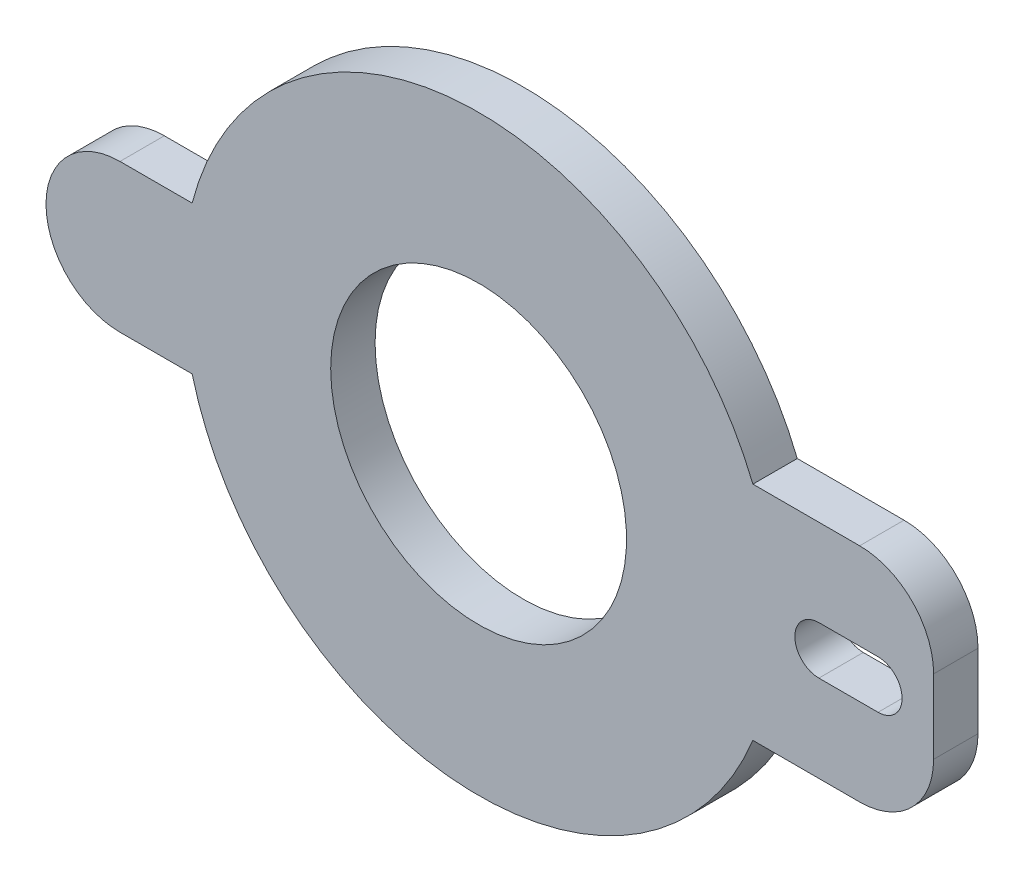
ISO-10303-21;
HEADER;
FILE_DESCRIPTION(('STEP AP214'),'2;1');
FILE_NAME('part.step','',(''),(''),'','','');
FILE_SCHEMA(('AUTOMOTIVE_DESIGN { 1 0 10303 214 1 1 1 1 }'));
ENDSEC;
DATA;
#1=APPLICATION_CONTEXT('core data for automotive mechanical design processes');
#2=APPLICATION_PROTOCOL_DEFINITION('international standard','automotive_design',2000,#1);
#3=PRODUCT_CONTEXT('',#1,'mechanical');
#4=PRODUCT('Part','Part','',(#3));
#5=PRODUCT_RELATED_PRODUCT_CATEGORY('part','',(#4));
#6=PRODUCT_DEFINITION_FORMATION('','',#4);
#7=PRODUCT_DEFINITION_CONTEXT('part definition',#1,'design');
#8=PRODUCT_DEFINITION('design','',#6,#7);
#9=PRODUCT_DEFINITION_SHAPE('','',#8);
#10=(LENGTH_UNIT() NAMED_UNIT(*) SI_UNIT(.MILLI.,.METRE.));
#11=(NAMED_UNIT(*) PLANE_ANGLE_UNIT() SI_UNIT($,.RADIAN.));
#12=(NAMED_UNIT(*) SI_UNIT($,.STERADIAN.) SOLID_ANGLE_UNIT());
#13=UNCERTAINTY_MEASURE_WITH_UNIT(LENGTH_MEASURE(1.E-05),#10,'distance_accuracy_value','');
#14=(GEOMETRIC_REPRESENTATION_CONTEXT(3) GLOBAL_UNCERTAINTY_ASSIGNED_CONTEXT((#13)) GLOBAL_UNIT_ASSIGNED_CONTEXT((#10,
#11,#12)) REPRESENTATION_CONTEXT('',''));
#15=CARTESIAN_POINT('',(0.,0.,0.));
#16=DIRECTION('',(0.,0.,1.));
#17=DIRECTION('',(1.,0.,0.));
#18=AXIS2_PLACEMENT_3D('',#15,#16,#17);
#19=CARTESIAN_POINT('',(-53.0320113912317,7.70338264670499,0.));
#20=DIRECTION('',(0.,0.,1.));
#21=DIRECTION('',(1.,0.,0.));
#22=AXIS2_PLACEMENT_3D('',#19,#20,#21);
#23=CYLINDRICAL_SURFACE('',#22,40.);
#24=CARTESIAN_POINT('',(-53.0320113912317,7.70338264670499,6.));
#25=DIRECTION('',(0.,0.,1.));
#26=DIRECTION('',(1.,0.,0.));
#27=AXIS2_PLACEMENT_3D('',#24,#25,#26);
#28=CIRCLE('',#27,40.);
#29=CARTESIAN_POINT('',(-15.9510189557534,22.703382646705,6.));
#30=VERTEX_POINT('',#29);
#31=CARTESIAN_POINT('',(-91.7618448533059,17.703382646705,6.));
#32=VERTEX_POINT('',#31);
#33=EDGE_CURVE('E173',#30,#32,#28,.T.);
#34=ORIENTED_EDGE('',*,*,#33,.F.);
#35=DIRECTION('',(0.,0.,1.));
#36=VECTOR('',#35,1.);
#37=CARTESIAN_POINT('',(-15.9510189557534,22.703382646705,0.));
#38=LINE('',#37,#36);
#39=CARTESIAN_POINT('',(-15.9510189557534,22.703382646705,0.));
#40=VERTEX_POINT('',#39);
#41=EDGE_CURVE('E11',#40,#30,#38,.T.);
#42=ORIENTED_EDGE('',*,*,#41,.F.);
#43=CARTESIAN_POINT('',(-53.0320113912317,7.70338264670499,0.));
#44=DIRECTION('',(0.,0.,1.));
#45=DIRECTION('',(1.,0.,0.));
#46=AXIS2_PLACEMENT_3D('',#43,#44,#45);
#47=CIRCLE('',#46,40.);
#48=CARTESIAN_POINT('',(-91.7618448533059,17.703382646705,0.));
#49=VERTEX_POINT('',#48);
#50=EDGE_CURVE('E176',#40,#49,#47,.T.);
#51=ORIENTED_EDGE('',*,*,#50,.T.);
#52=DIRECTION('',(0.,0.,1.));
#53=VECTOR('',#52,1.);
#54=CARTESIAN_POINT('',(-91.7618448533059,17.703382646705,0.));
#55=LINE('',#54,#53);
#56=EDGE_CURVE('E35',#49,#32,#55,.T.);
#57=ORIENTED_EDGE('',*,*,#56,.T.);
#58=EDGE_LOOP('',(#34,#42,#51,#57));
#59=FACE_BOUND('',#58,.T.);
#60=ADVANCED_FACE('F32',(#59),#23,.T.);
#61=CARTESIAN_POINT('',(-1.51889809135262,22.703382646705,0.));
#62=DIRECTION('',(0.,1.,0.));
#63=DIRECTION('',(-1.,0.,0.));
#64=AXIS2_PLACEMENT_3D('',#61,#62,#63);
#65=PLANE('',#64);
#66=DIRECTION('',(-1.,0.,0.));
#67=VECTOR('',#66,1.);
#68=CARTESIAN_POINT('',(-1.51889809135262,22.703382646705,6.));
#69=LINE('',#68,#67);
#70=CARTESIAN_POINT('',(-1.51889809135262,22.703382646705,6.));
#71=VERTEX_POINT('',#70);
#72=EDGE_CURVE('E180',#71,#30,#69,.T.);
#73=ORIENTED_EDGE('',*,*,#72,.F.);
#74=DIRECTION('',(0.,0.,1.));
#75=VECTOR('',#74,1.);
#76=CARTESIAN_POINT('',(-1.51889809135262,22.703382646705,0.));
#77=LINE('',#76,#75);
#78=CARTESIAN_POINT('',(-1.51889809135262,22.703382646705,0.));
#79=VERTEX_POINT('',#78);
#80=EDGE_CURVE('E40',#79,#71,#77,.T.);
#81=ORIENTED_EDGE('',*,*,#80,.F.);
#82=DIRECTION('',(-1.,0.,0.));
#83=VECTOR('',#82,1.);
#84=CARTESIAN_POINT('',(-1.51889809135262,22.703382646705,0.));
#85=LINE('',#84,#83);
#86=EDGE_CURVE('E204',#79,#40,#85,.T.);
#87=ORIENTED_EDGE('',*,*,#86,.T.);
#88=ORIENTED_EDGE('',*,*,#41,.T.);
#89=EDGE_LOOP('',(#73,#81,#87,#88));
#90=FACE_BOUND('',#89,.T.);
#91=ADVANCED_FACE('F261',(#90),#65,.T.);
#92=CARTESIAN_POINT('',(-1.51889809135262,12.703382646705,0.));
#93=DIRECTION('',(0.,0.,1.));
#94=DIRECTION('',(1.,0.,0.));
#95=AXIS2_PLACEMENT_3D('',#92,#93,#94);
#96=CYLINDRICAL_SURFACE('',#95,9.99999999999999);
#97=CARTESIAN_POINT('',(-1.51889809135262,12.703382646705,6.));
#98=DIRECTION('',(0.,0.,1.));
#99=DIRECTION('',(1.,0.,0.));
#100=AXIS2_PLACEMENT_3D('',#97,#98,#99);
#101=CIRCLE('',#100,9.99999999999999);
#102=CARTESIAN_POINT('',(8.48110190864737,12.703382646705,6.));
#103=VERTEX_POINT('',#102);
#104=EDGE_CURVE('E230',#103,#71,#101,.T.);
#105=ORIENTED_EDGE('',*,*,#104,.F.);
#106=DIRECTION('',(0.,0.,1.));
#107=VECTOR('',#106,1.);
#108=CARTESIAN_POINT('',(8.48110190864737,12.703382646705,0.));
#109=LINE('',#108,#107);
#110=CARTESIAN_POINT('',(8.48110190864737,12.703382646705,0.));
#111=VERTEX_POINT('',#110);
#112=EDGE_CURVE('E236',#111,#103,#109,.T.);
#113=ORIENTED_EDGE('',*,*,#112,.F.);
#114=CARTESIAN_POINT('',(-1.51889809135262,12.703382646705,0.));
#115=DIRECTION('',(0.,0.,1.));
#116=DIRECTION('',(1.,0.,0.));
#117=AXIS2_PLACEMENT_3D('',#114,#115,#116);
#118=CIRCLE('',#117,9.99999999999999);
#119=EDGE_CURVE('E201',#111,#79,#118,.T.);
#120=ORIENTED_EDGE('',*,*,#119,.T.);
#121=ORIENTED_EDGE('',*,*,#80,.T.);
#122=EDGE_LOOP('',(#105,#113,#120,#121));
#123=FACE_BOUND('',#122,.T.);
#124=ADVANCED_FACE('F289',(#123),#96,.T.);
#125=CARTESIAN_POINT('',(8.48110190864737,2.70338264670499,0.));
#126=DIRECTION('',(1.,0.,0.));
#127=DIRECTION('',(0.,0.,-1.));
#128=AXIS2_PLACEMENT_3D('',#125,#126,#127);
#129=PLANE('',#128);
#130=DIRECTION('',(0.,1.,0.));
#131=VECTOR('',#130,1.);
#132=CARTESIAN_POINT('',(8.48110190864737,2.70338264670499,6.));
#133=LINE('',#132,#131);
#134=CARTESIAN_POINT('',(8.48110190864737,2.70338264670499,6.));
#135=VERTEX_POINT('',#134);
#136=EDGE_CURVE('E227',#135,#103,#133,.T.);
#137=ORIENTED_EDGE('',*,*,#136,.F.);
#138=DIRECTION('',(0.,0.,1.));
#139=VECTOR('',#138,1.);
#140=CARTESIAN_POINT('',(8.48110190864737,2.70338264670499,0.));
#141=LINE('',#140,#139);
#142=CARTESIAN_POINT('',(8.48110190864737,2.70338264670499,0.));
#143=VERTEX_POINT('',#142);
#144=EDGE_CURVE('E238',#143,#135,#141,.T.);
#145=ORIENTED_EDGE('',*,*,#144,.F.);
#146=DIRECTION('',(0.,1.,0.));
#147=VECTOR('',#146,1.);
#148=CARTESIAN_POINT('',(8.48110190864737,2.70338264670499,0.));
#149=LINE('',#148,#147);
#150=EDGE_CURVE('E198',#143,#111,#149,.T.);
#151=ORIENTED_EDGE('',*,*,#150,.T.);
#152=ORIENTED_EDGE('',*,*,#112,.T.);
#153=EDGE_LOOP('',(#137,#145,#151,#152));
#154=FACE_BOUND('',#153,.T.);
#155=ADVANCED_FACE('F287',(#154),#129,.T.);
#156=CARTESIAN_POINT('',(-1.51889809135262,2.70338264670499,0.));
#157=DIRECTION('',(0.,0.,1.));
#158=DIRECTION('',(1.,0.,0.));
#159=AXIS2_PLACEMENT_3D('',#156,#157,#158);
#160=CYLINDRICAL_SURFACE('',#159,9.99999999999999);
#161=CARTESIAN_POINT('',(-1.51889809135262,2.70338264670499,6.));
#162=DIRECTION('',(0.,0.,1.));
#163=DIRECTION('',(1.,0.,0.));
#164=AXIS2_PLACEMENT_3D('',#161,#162,#163);
#165=CIRCLE('',#164,9.99999999999999);
#166=CARTESIAN_POINT('',(-1.51889809135262,-7.296617353295,6.));
#167=VERTEX_POINT('',#166);
#168=EDGE_CURVE('E224',#167,#135,#165,.T.);
#169=ORIENTED_EDGE('',*,*,#168,.F.);
#170=DIRECTION('',(0.,0.,1.));
#171=VECTOR('',#170,1.);
#172=CARTESIAN_POINT('',(-1.51889809135262,-7.296617353295,0.));
#173=LINE('',#172,#171);
#174=CARTESIAN_POINT('',(-1.51889809135262,-7.296617353295,0.));
#175=VERTEX_POINT('',#174);
#176=EDGE_CURVE('E240',#175,#167,#173,.T.);
#177=ORIENTED_EDGE('',*,*,#176,.F.);
#178=CARTESIAN_POINT('',(-1.51889809135262,2.70338264670499,0.));
#179=DIRECTION('',(0.,0.,1.));
#180=DIRECTION('',(1.,0.,0.));
#181=AXIS2_PLACEMENT_3D('',#178,#179,#180);
#182=CIRCLE('',#181,9.99999999999999);
#183=EDGE_CURVE('E195',#175,#143,#182,.T.);
#184=ORIENTED_EDGE('',*,*,#183,.T.);
#185=ORIENTED_EDGE('',*,*,#144,.T.);
#186=EDGE_LOOP('',(#169,#177,#184,#185));
#187=FACE_BOUND('',#186,.T.);
#188=ADVANCED_FACE('F283',(#187),#160,.T.);
#189=CARTESIAN_POINT('',(-15.9510189557534,-7.296617353295,0.));
#190=DIRECTION('',(0.,-1.,0.));
#191=DIRECTION('',(1.,0.,0.));
#192=AXIS2_PLACEMENT_3D('',#189,#190,#191);
#193=PLANE('',#192);
#194=DIRECTION('',(1.,0.,0.));
#195=VECTOR('',#194,1.);
#196=CARTESIAN_POINT('',(-15.9510189557534,-7.296617353295,6.));
#197=LINE('',#196,#195);
#198=CARTESIAN_POINT('',(-15.9510189557534,-7.296617353295,6.));
#199=VERTEX_POINT('',#198);
#200=EDGE_CURVE('E221',#199,#167,#197,.T.);
#201=ORIENTED_EDGE('',*,*,#200,.F.);
#202=DIRECTION('',(0.,0.,1.));
#203=VECTOR('',#202,1.);
#204=CARTESIAN_POINT('',(-15.9510189557534,-7.296617353295,0.));
#205=LINE('',#204,#203);
#206=CARTESIAN_POINT('',(-15.9510189557534,-7.296617353295,0.));
#207=VERTEX_POINT('',#206);
#208=EDGE_CURVE('E242',#207,#199,#205,.T.);
#209=ORIENTED_EDGE('',*,*,#208,.F.);
#210=DIRECTION('',(1.,0.,0.));
#211=VECTOR('',#210,1.);
#212=CARTESIAN_POINT('',(-15.9510189557534,-7.296617353295,0.));
#213=LINE('',#212,#211);
#214=EDGE_CURVE('E192',#207,#175,#213,.T.);
#215=ORIENTED_EDGE('',*,*,#214,.T.);
#216=ORIENTED_EDGE('',*,*,#176,.T.);
#217=EDGE_LOOP('',(#201,#209,#215,#216));
#218=FACE_BOUND('',#217,.T.);
#219=ADVANCED_FACE('F279',(#218),#193,.T.);
#220=CARTESIAN_POINT('',(-53.0320113912317,7.70338264670499,0.));
#221=DIRECTION('',(0.,0.,1.));
#222=DIRECTION('',(1.,0.,0.));
#223=AXIS2_PLACEMENT_3D('',#220,#221,#222);
#224=CYLINDRICAL_SURFACE('',#223,40.);
#225=CARTESIAN_POINT('',(-53.0320113912317,7.70338264670499,6.));
#226=DIRECTION('',(0.,0.,1.));
#227=DIRECTION('',(1.,0.,0.));
#228=AXIS2_PLACEMENT_3D('',#225,#226,#227);
#229=CIRCLE('',#228,40.);
#230=CARTESIAN_POINT('',(-91.7618448533059,-2.29661735329499,6.));
#231=VERTEX_POINT('',#230);
#232=EDGE_CURVE('E218',#231,#199,#229,.T.);
#233=ORIENTED_EDGE('',*,*,#232,.F.);
#234=DIRECTION('',(0.,0.,1.));
#235=VECTOR('',#234,1.);
#236=CARTESIAN_POINT('',(-91.7618448533059,-2.29661735329499,0.));
#237=LINE('',#236,#235);
#238=CARTESIAN_POINT('',(-91.7618448533059,-2.29661735329499,0.));
#239=VERTEX_POINT('',#238);
#240=EDGE_CURVE('E244',#239,#231,#237,.T.);
#241=ORIENTED_EDGE('',*,*,#240,.F.);
#242=CARTESIAN_POINT('',(-53.0320113912317,7.70338264670499,0.));
#243=DIRECTION('',(0.,0.,1.));
#244=DIRECTION('',(1.,0.,0.));
#245=AXIS2_PLACEMENT_3D('',#242,#243,#244);
#246=CIRCLE('',#245,40.);
#247=EDGE_CURVE('E189',#239,#207,#246,.T.);
#248=ORIENTED_EDGE('',*,*,#247,.T.);
#249=ORIENTED_EDGE('',*,*,#208,.T.);
#250=EDGE_LOOP('',(#233,#241,#248,#249));
#251=FACE_BOUND('',#250,.T.);
#252=ADVANCED_FACE('F275',(#251),#224,.T.);
#253=CARTESIAN_POINT('',(-101.518898091353,-2.29661735329501,0.));
#254=DIRECTION('',(0.,-1.,0.));
#255=DIRECTION('',(1.,0.,0.));
#256=AXIS2_PLACEMENT_3D('',#253,#254,#255);
#257=PLANE('',#256);
#258=DIRECTION('',(1.,0.,0.));
#259=VECTOR('',#258,1.);
#260=CARTESIAN_POINT('',(-101.518898091353,-2.29661735329501,6.));
#261=LINE('',#260,#259);
#262=CARTESIAN_POINT('',(-101.518898091353,-2.29661735329501,6.));
#263=VERTEX_POINT('',#262);
#264=EDGE_CURVE('E215',#263,#231,#261,.T.);
#265=ORIENTED_EDGE('',*,*,#264,.F.);
#266=DIRECTION('',(0.,0.,1.));
#267=VECTOR('',#266,1.);
#268=CARTESIAN_POINT('',(-101.518898091353,-2.29661735329501,0.));
#269=LINE('',#268,#267);
#270=CARTESIAN_POINT('',(-101.518898091353,-2.29661735329501,0.));
#271=VERTEX_POINT('',#270);
#272=EDGE_CURVE('E246',#271,#263,#269,.T.);
#273=ORIENTED_EDGE('',*,*,#272,.F.);
#274=DIRECTION('',(1.,0.,0.));
#275=VECTOR('',#274,1.);
#276=CARTESIAN_POINT('',(-101.518898091353,-2.29661735329501,0.));
#277=LINE('',#276,#275);
#278=EDGE_CURVE('E186',#271,#239,#277,.T.);
#279=ORIENTED_EDGE('',*,*,#278,.T.);
#280=ORIENTED_EDGE('',*,*,#240,.T.);
#281=EDGE_LOOP('',(#265,#273,#279,#280));
#282=FACE_BOUND('',#281,.T.);
#283=ADVANCED_FACE('F273',(#282),#257,.T.);
#284=CARTESIAN_POINT('',(-101.518898091353,7.70338264670499,0.));
#285=DIRECTION('',(0.,0.,1.));
#286=DIRECTION('',(1.,0.,0.));
#287=AXIS2_PLACEMENT_3D('',#284,#285,#286);
#288=CYLINDRICAL_SURFACE('',#287,10.);
#289=CARTESIAN_POINT('',(-101.518898091353,7.70338264670499,6.));
#290=DIRECTION('',(0.,0.,1.));
#291=DIRECTION('',(1.,0.,0.));
#292=AXIS2_PLACEMENT_3D('',#289,#290,#291);
#293=CIRCLE('',#292,10.);
#294=CARTESIAN_POINT('',(-101.518898091353,17.703382646705,6.));
#295=VERTEX_POINT('',#294);
#296=EDGE_CURVE('E212',#295,#263,#293,.T.);
#297=ORIENTED_EDGE('',*,*,#296,.F.);
#298=DIRECTION('',(0.,0.,1.));
#299=VECTOR('',#298,1.);
#300=CARTESIAN_POINT('',(-101.518898091353,17.703382646705,0.));
#301=LINE('',#300,#299);
#302=CARTESIAN_POINT('',(-101.518898091353,17.703382646705,0.));
#303=VERTEX_POINT('',#302);
#304=EDGE_CURVE('E247',#303,#295,#301,.T.);
#305=ORIENTED_EDGE('',*,*,#304,.F.);
#306=CARTESIAN_POINT('',(-101.518898091353,7.70338264670499,0.));
#307=DIRECTION('',(0.,0.,1.));
#308=DIRECTION('',(1.,0.,0.));
#309=AXIS2_PLACEMENT_3D('',#306,#307,#308);
#310=CIRCLE('',#309,10.);
#311=EDGE_CURVE('E183',#303,#271,#310,.T.);
#312=ORIENTED_EDGE('',*,*,#311,.T.);
#313=ORIENTED_EDGE('',*,*,#272,.T.);
#314=EDGE_LOOP('',(#297,#305,#312,#313));
#315=FACE_BOUND('',#314,.T.);
#316=ADVANCED_FACE('F269',(#315),#288,.T.);
#317=CARTESIAN_POINT('',(-91.7618448533059,17.703382646705,0.));
#318=DIRECTION('',(0.,1.,0.));
#319=DIRECTION('',(0.,0.,1.));
#320=AXIS2_PLACEMENT_3D('',#317,#318,#319);
#321=PLANE('',#320);
#322=DIRECTION('',(-1.,0.,0.));
#323=VECTOR('',#322,1.);
#324=CARTESIAN_POINT('',(-91.7618448533059,17.703382646705,6.));
#325=LINE('',#324,#323);
#326=EDGE_CURVE('E209',#32,#295,#325,.T.);
#327=ORIENTED_EDGE('',*,*,#326,.F.);
#328=ORIENTED_EDGE('',*,*,#56,.F.);
#329=DIRECTION('',(-1.,0.,0.));
#330=VECTOR('',#329,1.);
#331=CARTESIAN_POINT('',(-91.7618448533059,17.703382646705,0.));
#332=LINE('',#331,#330);
#333=EDGE_CURVE('E179',#49,#303,#332,.T.);
#334=ORIENTED_EDGE('',*,*,#333,.T.);
#335=ORIENTED_EDGE('',*,*,#304,.T.);
#336=EDGE_LOOP('',(#327,#328,#334,#335));
#337=FACE_BOUND('',#336,.T.);
#338=ADVANCED_FACE('F255',(#337),#321,.T.);
#339=CARTESIAN_POINT('',(-53.0320113912317,7.70338264670499,0.));
#340=DIRECTION('',(0.,0.,1.));
#341=DIRECTION('',(1.,0.,0.));
#342=AXIS2_PLACEMENT_3D('',#339,#340,#341);
#343=PLANE('',#342);
#344=DIRECTION('',(-1.,0.,0.));
#345=VECTOR('',#344,1.);
#346=CARTESIAN_POINT('',(-7.03201139123169,10.953382646705,0.));
#347=LINE('',#346,#345);
#348=CARTESIAN_POINT('',(0.96798860876831,10.953382646705,0.));
#349=VERTEX_POINT('',#348);
#350=CARTESIAN_POINT('',(-7.03201139123169,10.953382646705,0.));
#351=VERTEX_POINT('',#350);
#352=EDGE_CURVE('E141',#349,#351,#347,.T.);
#353=ORIENTED_EDGE('',*,*,#352,.T.);
#354=CARTESIAN_POINT('',(-7.03201139123169,7.70338264670499,0.));
#355=DIRECTION('',(0.,0.,1.));
#356=DIRECTION('',(1.,0.,0.));
#357=AXIS2_PLACEMENT_3D('',#354,#355,#356);
#358=CIRCLE('',#357,3.25);
#359=CARTESIAN_POINT('',(-7.03201139123169,4.45338264670499,0.));
#360=VERTEX_POINT('',#359);
#361=EDGE_CURVE('E135',#351,#360,#358,.T.);
#362=ORIENTED_EDGE('',*,*,#361,.T.);
#363=DIRECTION('',(1.,0.,0.));
#364=VECTOR('',#363,1.);
#365=CARTESIAN_POINT('',(-7.03201139123169,4.45338264670499,0.));
#366=LINE('',#365,#364);
#367=CARTESIAN_POINT('',(0.96798860876831,4.45338264670499,0.));
#368=VERTEX_POINT('',#367);
#369=EDGE_CURVE('E144',#360,#368,#366,.T.);
#370=ORIENTED_EDGE('',*,*,#369,.T.);
#371=CARTESIAN_POINT('',(0.967988608768311,7.70338264670499,0.));
#372=DIRECTION('',(0.,0.,1.));
#373=DIRECTION('',(1.,0.,0.));
#374=AXIS2_PLACEMENT_3D('',#371,#372,#373);
#375=CIRCLE('',#374,3.25);
#376=EDGE_CURVE('E48',#368,#349,#375,.T.);
#377=ORIENTED_EDGE('',*,*,#376,.T.);
#378=EDGE_LOOP('',(#353,#362,#370,#377));
#379=FACE_BOUND('',#378,.T.);
#380=CARTESIAN_POINT('',(-53.0320113912317,7.70338264670499,0.));
#381=DIRECTION('',(0.,0.,1.));
#382=DIRECTION('',(-1.,0.,0.));
#383=AXIS2_PLACEMENT_3D('',#380,#381,#382);
#384=CIRCLE('',#383,20.);
#385=CARTESIAN_POINT('',(-73.0320113912317,7.70338264670499,0.));
#386=VERTEX_POINT('',#385);
#387=EDGE_CURVE('E170',#386,#386,#384,.T.);
#388=ORIENTED_EDGE('',*,*,#387,.T.);
#389=EDGE_LOOP('',(#388));
#390=FACE_BOUND('',#389,.T.);
#391=ORIENTED_EDGE('',*,*,#50,.F.);
#392=ORIENTED_EDGE('',*,*,#86,.F.);
#393=ORIENTED_EDGE('',*,*,#119,.F.);
#394=ORIENTED_EDGE('',*,*,#150,.F.);
#395=ORIENTED_EDGE('',*,*,#183,.F.);
#396=ORIENTED_EDGE('',*,*,#214,.F.);
#397=ORIENTED_EDGE('',*,*,#247,.F.);
#398=ORIENTED_EDGE('',*,*,#278,.F.);
#399=ORIENTED_EDGE('',*,*,#311,.F.);
#400=ORIENTED_EDGE('',*,*,#333,.F.);
#401=EDGE_LOOP('',(#391,#392,#393,#394,#395,#396,#397,#398,#399,#400));
#402=FACE_BOUND('',#401,.T.);
#403=ADVANCED_FACE('F148',(#379,#390,#402),#343,.F.);
#404=CARTESIAN_POINT('',(-53.0320113912317,7.70338264670499,6.));
#405=DIRECTION('',(0.,0.,1.));
#406=DIRECTION('',(1.,0.,0.));
#407=AXIS2_PLACEMENT_3D('',#404,#405,#406);
#408=PLANE('',#407);
#409=CARTESIAN_POINT('',(-7.03201139123169,7.70338264670499,6.));
#410=DIRECTION('',(0.,0.,1.));
#411=DIRECTION('',(1.,0.,0.));
#412=AXIS2_PLACEMENT_3D('',#409,#410,#411);
#413=CIRCLE('',#412,3.25);
#414=CARTESIAN_POINT('',(-7.03201139123169,10.953382646705,6.));
#415=VERTEX_POINT('',#414);
#416=CARTESIAN_POINT('',(-7.03201139123169,4.45338264670499,6.));
#417=VERTEX_POINT('',#416);
#418=EDGE_CURVE('E56',#415,#417,#413,.T.);
#419=ORIENTED_EDGE('',*,*,#418,.F.);
#420=DIRECTION('',(-1.,0.,0.));
#421=VECTOR('',#420,1.);
#422=CARTESIAN_POINT('',(-7.03201139123169,10.953382646705,6.));
#423=LINE('',#422,#421);
#424=CARTESIAN_POINT('',(0.96798860876831,10.953382646705,6.));
#425=VERTEX_POINT('',#424);
#426=EDGE_CURVE('E151',#425,#415,#423,.T.);
#427=ORIENTED_EDGE('',*,*,#426,.F.);
#428=CARTESIAN_POINT('',(0.967988608768311,7.70338264670499,6.));
#429=DIRECTION('',(0.,0.,1.));
#430=DIRECTION('',(1.,0.,0.));
#431=AXIS2_PLACEMENT_3D('',#428,#429,#430);
#432=CIRCLE('',#431,3.25);
#433=CARTESIAN_POINT('',(0.967988608768311,4.453382646705,6.));
#434=VERTEX_POINT('',#433);
#435=EDGE_CURVE('E154',#434,#425,#432,.T.);
#436=ORIENTED_EDGE('',*,*,#435,.F.);
#437=DIRECTION('',(1.,0.,0.));
#438=VECTOR('',#437,1.);
#439=CARTESIAN_POINT('',(-7.03201139123169,4.45338264670499,6.));
#440=LINE('',#439,#438);
#441=EDGE_CURVE('E160',#417,#434,#440,.T.);
#442=ORIENTED_EDGE('',*,*,#441,.F.);
#443=EDGE_LOOP('',(#419,#427,#436,#442));
#444=FACE_BOUND('',#443,.T.);
#445=CARTESIAN_POINT('',(-53.0320113912317,7.70338264670499,6.));
#446=DIRECTION('',(0.,0.,1.));
#447=DIRECTION('',(-1.,0.,0.));
#448=AXIS2_PLACEMENT_3D('',#445,#446,#447);
#449=CIRCLE('',#448,20.);
#450=CARTESIAN_POINT('',(-73.0320113912317,7.70338264670499,6.));
#451=VERTEX_POINT('',#450);
#452=EDGE_CURVE('E166',#451,#451,#449,.T.);
#453=ORIENTED_EDGE('',*,*,#452,.F.);
#454=EDGE_LOOP('',(#453));
#455=FACE_BOUND('',#454,.T.);
#456=ORIENTED_EDGE('',*,*,#33,.T.);
#457=ORIENTED_EDGE('',*,*,#326,.T.);
#458=ORIENTED_EDGE('',*,*,#296,.T.);
#459=ORIENTED_EDGE('',*,*,#264,.T.);
#460=ORIENTED_EDGE('',*,*,#232,.T.);
#461=ORIENTED_EDGE('',*,*,#200,.T.);
#462=ORIENTED_EDGE('',*,*,#168,.T.);
#463=ORIENTED_EDGE('',*,*,#136,.T.);
#464=ORIENTED_EDGE('',*,*,#104,.T.);
#465=ORIENTED_EDGE('',*,*,#72,.T.);
#466=EDGE_LOOP('',(#456,#457,#458,#459,#460,#461,#462,#463,#464,#465));
#467=FACE_BOUND('',#466,.T.);
#468=ADVANCED_FACE('F257',(#444,#455,#467),#408,.T.);
#469=CARTESIAN_POINT('',(-53.0320113912317,7.70338264670499,0.));
#470=DIRECTION('',(0.,0.,1.));
#471=DIRECTION('',(1.,0.,0.));
#472=AXIS2_PLACEMENT_3D('',#469,#470,#471);
#473=CYLINDRICAL_SURFACE('',#472,20.);
#474=ORIENTED_EDGE('',*,*,#387,.F.);
#475=EDGE_LOOP('',(#474));
#476=FACE_BOUND('',#475,.T.);
#477=ORIENTED_EDGE('',*,*,#452,.T.);
#478=EDGE_LOOP('',(#477));
#479=FACE_BOUND('',#478,.T.);
#480=ADVANCED_FACE('F379',(#476,#479),#473,.F.);
#481=CARTESIAN_POINT('',(-7.03201139123169,7.70338264670499,0.));
#482=DIRECTION('',(0.,0.,1.));
#483=DIRECTION('',(1.,0.,0.));
#484=AXIS2_PLACEMENT_3D('',#481,#482,#483);
#485=CYLINDRICAL_SURFACE('',#484,3.25);
#486=ORIENTED_EDGE('',*,*,#418,.T.);
#487=DIRECTION('',(0.,0.,1.));
#488=VECTOR('',#487,1.);
#489=CARTESIAN_POINT('',(-7.03201139123169,4.45338264670499,0.));
#490=LINE('',#489,#488);
#491=EDGE_CURVE('E131',#360,#417,#490,.T.);
#492=ORIENTED_EDGE('',*,*,#491,.F.);
#493=ORIENTED_EDGE('',*,*,#361,.F.);
#494=DIRECTION('',(0.,0.,1.));
#495=VECTOR('',#494,1.);
#496=CARTESIAN_POINT('',(-7.03201139123169,10.953382646705,0.));
#497=LINE('',#496,#495);
#498=EDGE_CURVE('E164',#351,#415,#497,.T.);
#499=ORIENTED_EDGE('',*,*,#498,.T.);
#500=EDGE_LOOP('',(#486,#492,#493,#499));
#501=FACE_BOUND('',#500,.T.);
#502=ADVANCED_FACE('F133',(#501),#485,.F.);
#503=CARTESIAN_POINT('',(-7.03201139123169,10.953382646705,0.));
#504=DIRECTION('',(0.,1.,0.));
#505=DIRECTION('',(-1.,0.,0.));
#506=AXIS2_PLACEMENT_3D('',#503,#504,#505);
#507=PLANE('',#506);
#508=ORIENTED_EDGE('',*,*,#426,.T.);
#509=ORIENTED_EDGE('',*,*,#498,.F.);
#510=ORIENTED_EDGE('',*,*,#352,.F.);
#511=DIRECTION('',(0.,0.,1.));
#512=VECTOR('',#511,1.);
#513=CARTESIAN_POINT('',(0.96798860876831,10.953382646705,0.));
#514=LINE('',#513,#512);
#515=EDGE_CURVE('E167',#349,#425,#514,.T.);
#516=ORIENTED_EDGE('',*,*,#515,.T.);
#517=EDGE_LOOP('',(#508,#509,#510,#516));
#518=FACE_BOUND('',#517,.T.);
#519=ADVANCED_FACE('F398',(#518),#507,.F.);
#520=CARTESIAN_POINT('',(0.967988608768311,7.70338264670499,0.));
#521=DIRECTION('',(0.,0.,1.));
#522=DIRECTION('',(1.,0.,0.));
#523=AXIS2_PLACEMENT_3D('',#520,#521,#522);
#524=CYLINDRICAL_SURFACE('',#523,3.25);
#525=ORIENTED_EDGE('',*,*,#435,.T.);
#526=ORIENTED_EDGE('',*,*,#515,.F.);
#527=ORIENTED_EDGE('',*,*,#376,.F.);
#528=DIRECTION('',(0.,0.,1.));
#529=VECTOR('',#528,1.);
#530=CARTESIAN_POINT('',(0.967988608768311,4.453382646705,0.));
#531=LINE('',#530,#529);
#532=EDGE_CURVE('E140',#368,#434,#531,.T.);
#533=ORIENTED_EDGE('',*,*,#532,.T.);
#534=EDGE_LOOP('',(#525,#526,#527,#533));
#535=FACE_BOUND('',#534,.T.);
#536=ADVANCED_FACE('F407',(#535),#524,.F.);
#537=CARTESIAN_POINT('',(-7.03201139123169,4.45338264670499,0.));
#538=DIRECTION('',(0.,-1.,0.));
#539=DIRECTION('',(1.,0.,0.));
#540=AXIS2_PLACEMENT_3D('',#537,#538,#539);
#541=PLANE('',#540);
#542=ORIENTED_EDGE('',*,*,#441,.T.);
#543=ORIENTED_EDGE('',*,*,#532,.F.);
#544=ORIENTED_EDGE('',*,*,#369,.F.);
#545=ORIENTED_EDGE('',*,*,#491,.T.);
#546=EDGE_LOOP('',(#542,#543,#544,#545));
#547=FACE_BOUND('',#546,.T.);
#548=ADVANCED_FACE('F145',(#547),#541,.F.);
#549=CLOSED_SHELL('',(#60,#91,#124,#155,#188,#219,#252,#283,#316,#338,#403,#468,#480,#502,#519,
#536,#548));
#550=MANIFOLD_SOLID_BREP('B2',#549);
#551=ADVANCED_BREP_SHAPE_REPRESENTATION('',(#18,#550),#14);
#552=SHAPE_DEFINITION_REPRESENTATION(#9,#551);
ENDSEC;
END-ISO-10303-21;
